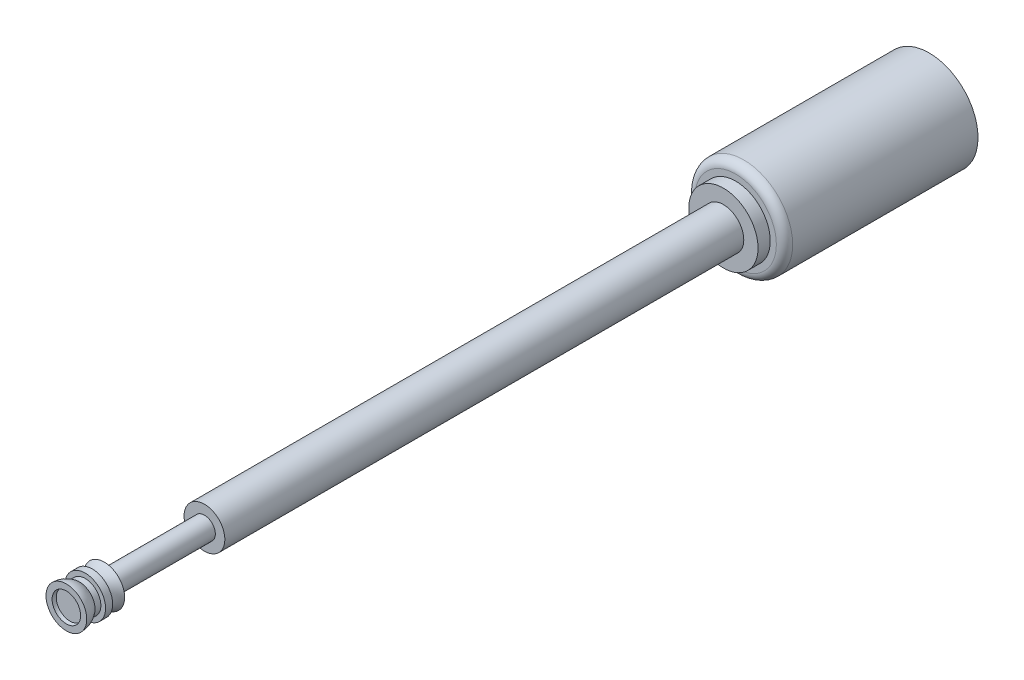
ISO-10303-21;
HEADER;
FILE_DESCRIPTION(('STEP AP214'),'2;1');
FILE_NAME('part.step','',(''),(''),'','','');
FILE_SCHEMA(('AUTOMOTIVE_DESIGN { 1 0 10303 214 1 1 1 1 }'));
ENDSEC;
DATA;
#1=APPLICATION_CONTEXT('core data for automotive mechanical design processes');
#2=APPLICATION_PROTOCOL_DEFINITION('international standard','automotive_design',2000,#1);
#3=PRODUCT_CONTEXT('',#1,'mechanical');
#4=PRODUCT('Part','Part','',(#3));
#5=PRODUCT_RELATED_PRODUCT_CATEGORY('part','',(#4));
#6=PRODUCT_DEFINITION_FORMATION('','',#4);
#7=PRODUCT_DEFINITION_CONTEXT('part definition',#1,'design');
#8=PRODUCT_DEFINITION('design','',#6,#7);
#9=PRODUCT_DEFINITION_SHAPE('','',#8);
#10=(LENGTH_UNIT() NAMED_UNIT(*) SI_UNIT(.MILLI.,.METRE.));
#11=(NAMED_UNIT(*) PLANE_ANGLE_UNIT() SI_UNIT($,.RADIAN.));
#12=(NAMED_UNIT(*) SI_UNIT($,.STERADIAN.) SOLID_ANGLE_UNIT());
#13=UNCERTAINTY_MEASURE_WITH_UNIT(LENGTH_MEASURE(1.E-05),#10,'distance_accuracy_value','');
#14=(GEOMETRIC_REPRESENTATION_CONTEXT(3) GLOBAL_UNCERTAINTY_ASSIGNED_CONTEXT((#13)) GLOBAL_UNIT_ASSIGNED_CONTEXT((#10,
#11,#12)) REPRESENTATION_CONTEXT('',''));
#15=CARTESIAN_POINT('',(0.,0.,0.));
#16=DIRECTION('',(0.,0.,1.));
#17=DIRECTION('',(1.,0.,0.));
#18=AXIS2_PLACEMENT_3D('',#15,#16,#17);
#19=CARTESIAN_POINT('',(0.,0.,15.5));
#20=DIRECTION('',(0.,0.,-1.));
#21=DIRECTION('',(-1.,0.,0.));
#22=AXIS2_PLACEMENT_3D('',#19,#20,#21);
#23=CYLINDRICAL_SURFACE('',#22,0.5);
#24=CARTESIAN_POINT('',(0.,0.,13.04));
#25=DIRECTION('',(0.,0.,-1.));
#26=DIRECTION('',(-1.,0.,0.));
#27=AXIS2_PLACEMENT_3D('',#24,#25,#26);
#28=CIRCLE('',#27,0.5);
#29=CARTESIAN_POINT('',(-0.5,0.,13.04));
#30=VERTEX_POINT('',#29);
#31=EDGE_CURVE('E56',#30,#30,#28,.T.);
#32=ORIENTED_EDGE('',*,*,#31,.T.);
#33=EDGE_LOOP('',(#32));
#34=FACE_BOUND('',#33,.T.);
#35=CARTESIAN_POINT('',(0.,0.,0.3));
#36=DIRECTION('',(0.,0.,1.));
#37=DIRECTION('',(1.,0.,0.));
#38=AXIS2_PLACEMENT_3D('',#35,#36,#37);
#39=CIRCLE('',#38,0.5);
#40=CARTESIAN_POINT('',(0.5,0.,0.3));
#41=VERTEX_POINT('',#40);
#42=EDGE_CURVE('E43',#41,#41,#39,.T.);
#43=ORIENTED_EDGE('',*,*,#42,.T.);
#44=EDGE_LOOP('',(#43));
#45=FACE_BOUND('',#44,.T.);
#46=ADVANCED_FACE('F32',(#34,#45),#23,.T.);
#47=CARTESIAN_POINT('',(0.,0.,0.3));
#48=DIRECTION('',(0.,0.,-1.));
#49=DIRECTION('',(-1.,0.,0.));
#50=AXIS2_PLACEMENT_3D('',#47,#48,#49);
#51=CYLINDRICAL_SURFACE('',#50,0.85);
#52=CARTESIAN_POINT('',(0.,0.,0.3));
#53=DIRECTION('',(0.,0.,1.));
#54=DIRECTION('',(1.,0.,0.));
#55=AXIS2_PLACEMENT_3D('',#52,#53,#54);
#56=CIRCLE('',#55,0.85);
#57=CARTESIAN_POINT('',(0.85,0.,0.3));
#58=VERTEX_POINT('',#57);
#59=EDGE_CURVE('E48',#58,#58,#56,.T.);
#60=ORIENTED_EDGE('',*,*,#59,.F.);
#61=EDGE_LOOP('',(#60));
#62=FACE_BOUND('',#61,.T.);
#63=CARTESIAN_POINT('',(0.,0.,0.));
#64=DIRECTION('',(0.,0.,1.));
#65=DIRECTION('',(1.,0.,0.));
#66=AXIS2_PLACEMENT_3D('',#63,#64,#65);
#67=CIRCLE('',#66,0.85);
#68=CARTESIAN_POINT('',(0.85,0.,0.));
#69=VERTEX_POINT('',#68);
#70=EDGE_CURVE('E102',#69,#69,#67,.T.);
#71=ORIENTED_EDGE('',*,*,#70,.T.);
#72=EDGE_LOOP('',(#71));
#73=FACE_BOUND('',#72,.T.);
#74=ADVANCED_FACE('F109',(#62,#73),#51,.T.);
#75=CARTESIAN_POINT('',(0.,0.,0.3));
#76=DIRECTION('',(0.,0.,1.));
#77=DIRECTION('',(1.,0.,0.));
#78=AXIS2_PLACEMENT_3D('',#75,#76,#77);
#79=PLANE('',#78);
#80=ORIENTED_EDGE('',*,*,#42,.F.);
#81=EDGE_LOOP('',(#80));
#82=FACE_BOUND('',#81,.T.);
#83=ORIENTED_EDGE('',*,*,#59,.T.);
#84=EDGE_LOOP('',(#83));
#85=FACE_BOUND('',#84,.T.);
#86=ADVANCED_FACE('F107',(#82,#85),#79,.T.);
#87=CARTESIAN_POINT('',(0.,0.,-4.75));
#88=DIRECTION('',(0.,0.,1.));
#89=DIRECTION('',(1.,0.,0.));
#90=AXIS2_PLACEMENT_3D('',#87,#88,#89);
#91=CYLINDRICAL_SURFACE('',#90,1.2);
#92=CARTESIAN_POINT('',(0.,0.,-0.2));
#93=DIRECTION('',(0.,0.,1.));
#94=DIRECTION('',(1.,0.,0.));
#95=AXIS2_PLACEMENT_3D('',#92,#93,#94);
#96=CIRCLE('',#95,1.2);
#97=CARTESIAN_POINT('',(1.2,0.,-0.2));
#98=VERTEX_POINT('',#97);
#99=EDGE_CURVE('E99',#98,#98,#96,.F.);
#100=ORIENTED_EDGE('',*,*,#99,.T.);
#101=EDGE_LOOP('',(#100));
#102=FACE_BOUND('',#101,.T.);
#103=CARTESIAN_POINT('',(0.,0.,-4.75));
#104=DIRECTION('',(0.,0.,1.));
#105=DIRECTION('',(1.,0.,0.));
#106=AXIS2_PLACEMENT_3D('',#103,#104,#105);
#107=CIRCLE('',#106,1.2);
#108=CARTESIAN_POINT('',(1.2,0.,-4.75));
#109=VERTEX_POINT('',#108);
#110=EDGE_CURVE('E93',#109,#109,#107,.T.);
#111=ORIENTED_EDGE('',*,*,#110,.T.);
#112=EDGE_LOOP('',(#111));
#113=FACE_BOUND('',#112,.T.);
#114=ADVANCED_FACE('F143',(#102,#113),#91,.T.);
#115=CARTESIAN_POINT('',(0.,0.,-4.75));
#116=DIRECTION('',(0.,0.,1.));
#117=DIRECTION('',(1.,0.,0.));
#118=AXIS2_PLACEMENT_3D('',#115,#116,#117);
#119=PLANE('',#118);
#120=ORIENTED_EDGE('',*,*,#110,.F.);
#121=EDGE_LOOP('',(#120));
#122=FACE_BOUND('',#121,.T.);
#123=ADVANCED_FACE('F119',(#122),#119,.F.);
#124=CARTESIAN_POINT('',(0.,0.,0.));
#125=DIRECTION('',(0.,0.,1.));
#126=DIRECTION('',(1.,0.,0.));
#127=AXIS2_PLACEMENT_3D('',#124,#125,#126);
#128=PLANE('',#127);
#129=ORIENTED_EDGE('',*,*,#70,.F.);
#130=EDGE_LOOP('',(#129));
#131=FACE_BOUND('',#130,.T.);
#132=CARTESIAN_POINT('',(0.,0.,0.));
#133=DIRECTION('',(0.,0.,1.));
#134=DIRECTION('',(1.,0.,0.));
#135=AXIS2_PLACEMENT_3D('',#132,#133,#134);
#136=CIRCLE('',#135,1.);
#137=CARTESIAN_POINT('',(1.,0.,0.));
#138=VERTEX_POINT('',#137);
#139=EDGE_CURVE('E96',#138,#138,#136,.T.);
#140=ORIENTED_EDGE('',*,*,#139,.T.);
#141=EDGE_LOOP('',(#140));
#142=FACE_BOUND('',#141,.T.);
#143=ADVANCED_FACE('F115',(#131,#142),#128,.T.);
#144=CARTESIAN_POINT('',(0.,0.,-0.2));
#145=DIRECTION('',(0.,0.,1.));
#146=DIRECTION('',(1.,0.,0.));
#147=AXIS2_PLACEMENT_3D('',#144,#145,#146);
#148=TOROIDAL_SURFACE('',#147,1.,0.2);
#149=ORIENTED_EDGE('',*,*,#99,.F.);
#150=EDGE_LOOP('',(#149));
#151=FACE_BOUND('',#150,.T.);
#152=ORIENTED_EDGE('',*,*,#139,.F.);
#153=EDGE_LOOP('',(#152));
#154=FACE_BOUND('',#153,.T.);
#155=ADVANCED_FACE('F118',(#151,#154),#148,.T.);
#156=CARTESIAN_POINT('',(-0.266992624909092,0.,13.04));
#157=DIRECTION('',(0.,0.,-1.));
#158=DIRECTION('',(-1.,0.,0.));
#159=AXIS2_PLACEMENT_3D('',#156,#157,#158);
#160=PLANE('',#159);
#161=CARTESIAN_POINT('',(0.,0.,13.04));
#162=DIRECTION('',(0.,0.,-1.));
#163=DIRECTION('',(-1.,0.,0.));
#164=AXIS2_PLACEMENT_3D('',#161,#162,#163);
#165=CIRCLE('',#164,0.266992624909092);
#166=CARTESIAN_POINT('',(-0.266992624909092,0.,13.04));
#167=VERTEX_POINT('',#166);
#168=EDGE_CURVE('E64',#167,#167,#165,.T.);
#169=ORIENTED_EDGE('',*,*,#168,.T.);
#170=EDGE_LOOP('',(#169));
#171=FACE_BOUND('',#170,.T.);
#172=ORIENTED_EDGE('',*,*,#31,.F.);
#173=EDGE_LOOP('',(#172));
#174=FACE_BOUND('',#173,.T.);
#175=ADVANCED_FACE('F124',(#171,#174),#160,.F.);
#176=CARTESIAN_POINT('',(-0.266992624909092,0.,15.5));
#177=DIRECTION('',(0.,0.,1.));
#178=DIRECTION('',(1.,0.,0.));
#179=AXIS2_PLACEMENT_3D('',#176,#177,#178);
#180=PLANE('',#179);
#181=CARTESIAN_POINT('',(0.,0.,15.5));
#182=DIRECTION('',(0.,0.,-1.));
#183=DIRECTION('',(-1.,0.,0.));
#184=AXIS2_PLACEMENT_3D('',#181,#182,#183);
#185=CIRCLE('',#184,0.266992624909092);
#186=CARTESIAN_POINT('',(-0.266992624909092,0.,15.5));
#187=VERTEX_POINT('',#186);
#188=EDGE_CURVE('E69',#187,#187,#185,.T.);
#189=ORIENTED_EDGE('',*,*,#188,.F.);
#190=EDGE_LOOP('',(#189));
#191=FACE_BOUND('',#190,.T.);
#192=CARTESIAN_POINT('',(0.,0.,15.5));
#193=DIRECTION('',(0.,0.,-1.));
#194=DIRECTION('',(-1.,0.,0.));
#195=AXIS2_PLACEMENT_3D('',#192,#193,#194);
#196=CIRCLE('',#195,0.499999999999999);
#197=CARTESIAN_POINT('',(-0.499999999999999,0.,15.5));
#198=VERTEX_POINT('',#197);
#199=EDGE_CURVE('E60',#198,#198,#196,.F.);
#200=ORIENTED_EDGE('',*,*,#199,.F.);
#201=EDGE_LOOP('',(#200));
#202=FACE_BOUND('',#201,.T.);
#203=ADVANCED_FACE('F130',(#191,#202),#180,.F.);
#204=CARTESIAN_POINT('',(0.,0.,15.5));
#205=DIRECTION('',(0.,0.,-1.));
#206=DIRECTION('',(-1.,0.,0.));
#207=AXIS2_PLACEMENT_3D('',#204,#205,#206);
#208=CYLINDRICAL_SURFACE('',#207,0.266992624909092);
#209=ORIENTED_EDGE('',*,*,#168,.F.);
#210=EDGE_LOOP('',(#209));
#211=FACE_BOUND('',#210,.T.);
#212=ORIENTED_EDGE('',*,*,#188,.T.);
#213=EDGE_LOOP('',(#212));
#214=FACE_BOUND('',#213,.T.);
#215=ADVANCED_FACE('F186',(#211,#214),#208,.T.);
#216=CARTESIAN_POINT('',(0.,0.,16.34));
#217=DIRECTION('',(0.,0.,1.));
#218=DIRECTION('',(1.,0.,0.));
#219=AXIS2_PLACEMENT_3D('',#216,#217,#218);
#220=PLANE('',#219);
#221=CARTESIAN_POINT('',(0.,0.,16.34));
#222=DIRECTION('',(0.,0.,1.));
#223=DIRECTION('',(1.,0.,0.));
#224=AXIS2_PLACEMENT_3D('',#221,#222,#223);
#225=CIRCLE('',#224,0.338230690505755);
#226=CARTESIAN_POINT('',(0.338230690505755,0.,16.34));
#227=VERTEX_POINT('',#226);
#228=EDGE_CURVE('E52',#227,#227,#225,.F.);
#229=ORIENTED_EDGE('',*,*,#228,.F.);
#230=EDGE_LOOP('',(#229));
#231=FACE_BOUND('',#230,.T.);
#232=ADVANCED_FACE('F178',(#231),#220,.T.);
#233=CARTESIAN_POINT('',(0.,0.,16.43));
#234=DIRECTION('',(0.,0.,-1.));
#235=DIRECTION('',(1.,0.,0.));
#236=AXIS2_PLACEMENT_3D('',#233,#234,#235);
#237=SPHERICAL_SURFACE('',#236,0.35);
#238=ORIENTED_EDGE('',*,*,#228,.T.);
#239=EDGE_LOOP('',(#238));
#240=FACE_BOUND('',#239,.T.);
#241=CARTESIAN_POINT('',(0.,0.,16.43));
#242=DIRECTION('',(0.,0.,-1.));
#243=DIRECTION('',(-1.,0.,0.));
#244=AXIS2_PLACEMENT_3D('',#241,#242,#243);
#245=CIRCLE('',#244,0.35);
#246=CARTESIAN_POINT('',(-0.35,0.,16.43));
#247=VERTEX_POINT('',#246);
#248=EDGE_CURVE('E58',#247,#247,#245,.T.);
#249=ORIENTED_EDGE('',*,*,#248,.F.);
#250=EDGE_LOOP('',(#249));
#251=FACE_BOUND('',#250,.T.);
#252=ADVANCED_FACE('F168',(#240,#251),#237,.F.);
#253=CARTESIAN_POINT('',(0.35,0.,16.43));
#254=DIRECTION('',(0.,0.,-1.));
#255=DIRECTION('',(-1.,0.,0.));
#256=AXIS2_PLACEMENT_3D('',#253,#254,#255);
#257=PLANE('',#256);
#258=CARTESIAN_POINT('',(0.,0.,16.43));
#259=DIRECTION('',(0.,0.,-1.));
#260=DIRECTION('',(-1.,0.,0.));
#261=AXIS2_PLACEMENT_3D('',#258,#259,#260);
#262=CIRCLE('',#261,0.5);
#263=CARTESIAN_POINT('',(-0.5,0.,16.43));
#264=VERTEX_POINT('',#263);
#265=EDGE_CURVE('E75',#264,#264,#262,.T.);
#266=ORIENTED_EDGE('',*,*,#265,.F.);
#267=EDGE_LOOP('',(#266));
#268=FACE_BOUND('',#267,.T.);
#269=ORIENTED_EDGE('',*,*,#248,.T.);
#270=EDGE_LOOP('',(#269));
#271=FACE_BOUND('',#270,.T.);
#272=ADVANCED_FACE('F177',(#268,#271),#257,.F.);
#273=CARTESIAN_POINT('',(0.,0.,16.43));
#274=DIRECTION('',(0.,0.,-1.));
#275=DIRECTION('',(1.,0.,0.));
#276=AXIS2_PLACEMENT_3D('',#273,#274,#275);
#277=SPHERICAL_SURFACE('',#276,0.499999999999999);
#278=CARTESIAN_POINT('',(0.,0.,16.1113820747194));
#279=DIRECTION('',(0.,0.,-1.));
#280=DIRECTION('',(-1.,0.,0.));
#281=AXIS2_PLACEMENT_3D('',#278,#279,#280);
#282=CIRCLE('',#281,0.385334423183124);
#283=CARTESIAN_POINT('',(-0.385334423183124,0.,16.1113820747194));
#284=VERTEX_POINT('',#283);
#285=EDGE_CURVE('E78',#284,#284,#282,.T.);
#286=ORIENTED_EDGE('',*,*,#285,.F.);
#287=EDGE_LOOP('',(#286));
#288=FACE_BOUND('',#287,.T.);
#289=ORIENTED_EDGE('',*,*,#265,.T.);
#290=EDGE_LOOP('',(#289));
#291=FACE_BOUND('',#290,.T.);
#292=ADVANCED_FACE('F184',(#288,#291),#277,.T.);
#293=CARTESIAN_POINT('',(0.,0.,15.5));
#294=DIRECTION('',(0.,0.,-1.));
#295=DIRECTION('',(-1.,0.,0.));
#296=AXIS2_PLACEMENT_3D('',#293,#294,#295);
#297=CYLINDRICAL_SURFACE('',#296,0.385334423183123);
#298=CARTESIAN_POINT('',(0.,0.,15.9679785667846));
#299=DIRECTION('',(0.,0.,-1.));
#300=DIRECTION('',(-1.,0.,0.));
#301=AXIS2_PLACEMENT_3D('',#298,#299,#300);
#302=CIRCLE('',#301,0.385334423183123);
#303=CARTESIAN_POINT('',(-0.385334423183123,0.,15.9679785667846));
#304=VERTEX_POINT('',#303);
#305=EDGE_CURVE('E81',#304,#304,#302,.T.);
#306=ORIENTED_EDGE('',*,*,#305,.F.);
#307=EDGE_LOOP('',(#306));
#308=FACE_BOUND('',#307,.T.);
#309=ORIENTED_EDGE('',*,*,#285,.T.);
#310=EDGE_LOOP('',(#309));
#311=FACE_BOUND('',#310,.T.);
#312=ADVANCED_FACE('F325',(#308,#311),#297,.T.);
#313=CARTESIAN_POINT('',(0.385334423183123,0.,15.9679785667846));
#314=DIRECTION('',(0.,0.,-1.));
#315=DIRECTION('',(-1.,0.,0.));
#316=AXIS2_PLACEMENT_3D('',#313,#314,#315);
#317=PLANE('',#316);
#318=CARTESIAN_POINT('',(0.,0.,15.9679785667846));
#319=DIRECTION('',(0.,0.,-1.));
#320=DIRECTION('',(-1.,0.,0.));
#321=AXIS2_PLACEMENT_3D('',#318,#319,#320);
#322=CIRCLE('',#321,0.5);
#323=CARTESIAN_POINT('',(-0.5,0.,15.9679785667846));
#324=VERTEX_POINT('',#323);
#325=EDGE_CURVE('E84',#324,#324,#322,.T.);
#326=ORIENTED_EDGE('',*,*,#325,.F.);
#327=EDGE_LOOP('',(#326));
#328=FACE_BOUND('',#327,.T.);
#329=ORIENTED_EDGE('',*,*,#305,.T.);
#330=EDGE_LOOP('',(#329));
#331=FACE_BOUND('',#330,.T.);
#332=ADVANCED_FACE('F315',(#328,#331),#317,.F.);
#333=CARTESIAN_POINT('',(0.,0.,15.5));
#334=DIRECTION('',(0.,0.,-1.));
#335=DIRECTION('',(-1.,0.,0.));
#336=AXIS2_PLACEMENT_3D('',#333,#334,#335);
#337=CYLINDRICAL_SURFACE('',#336,0.5);
#338=CARTESIAN_POINT('',(0.,0.,15.7933109872127));
#339=DIRECTION('',(0.,0.,-1.));
#340=DIRECTION('',(-1.,0.,0.));
#341=AXIS2_PLACEMENT_3D('',#338,#339,#340);
#342=CIRCLE('',#341,0.5);
#343=CARTESIAN_POINT('',(-0.5,0.,15.7933109872127));
#344=VERTEX_POINT('',#343);
#345=EDGE_CURVE('E87',#344,#344,#342,.T.);
#346=ORIENTED_EDGE('',*,*,#345,.F.);
#347=EDGE_LOOP('',(#346));
#348=FACE_BOUND('',#347,.T.);
#349=ORIENTED_EDGE('',*,*,#325,.T.);
#350=EDGE_LOOP('',(#349));
#351=FACE_BOUND('',#350,.T.);
#352=ADVANCED_FACE('F305',(#348,#351),#337,.T.);
#353=CARTESIAN_POINT('',(0.5,0.,15.7933109872127));
#354=DIRECTION('',(0.,0.,1.));
#355=DIRECTION('',(1.,0.,0.));
#356=AXIS2_PLACEMENT_3D('',#353,#354,#355);
#357=PLANE('',#356);
#358=CARTESIAN_POINT('',(0.,0.,15.7933109872127));
#359=DIRECTION('',(0.,0.,-1.));
#360=DIRECTION('',(-1.,0.,0.));
#361=AXIS2_PLACEMENT_3D('',#358,#359,#360);
#362=CIRCLE('',#361,0.416056350546994);
#363=CARTESIAN_POINT('',(-0.416056350546994,0.,15.7933109872127));
#364=VERTEX_POINT('',#363);
#365=EDGE_CURVE('E90',#364,#364,#362,.T.);
#366=ORIENTED_EDGE('',*,*,#365,.F.);
#367=EDGE_LOOP('',(#366));
#368=FACE_BOUND('',#367,.T.);
#369=ORIENTED_EDGE('',*,*,#345,.T.);
#370=EDGE_LOOP('',(#369));
#371=FACE_BOUND('',#370,.T.);
#372=ADVANCED_FACE('F296',(#368,#371),#357,.F.);
#373=CARTESIAN_POINT('',(0.,0.,15.7933109872127));
#374=DIRECTION('',(0.,0.,-1.));
#375=DIRECTION('',(-1.,0.,0.));
#376=AXIS2_PLACEMENT_3D('',#373,#374,#375);
#377=TOROIDAL_SURFACE('',#376,0.970463218187957,0.554406867640962);
#378=ORIENTED_EDGE('',*,*,#199,.T.);
#379=EDGE_LOOP('',(#378));
#380=FACE_BOUND('',#379,.T.);
#381=ORIENTED_EDGE('',*,*,#365,.T.);
#382=EDGE_LOOP('',(#381));
#383=FACE_BOUND('',#382,.T.);
#384=ADVANCED_FACE('F293',(#380,#383),#377,.F.);
#385=CLOSED_SHELL('',(#46,#74,#86,#114,#123,#143,#155,#175,#203,#215,#232,#252,#272,#292,#312,
#332,#352,#372,#384));
#386=CARTESIAN_POINT('',(0.,0.,16.3037364268854));
#387=DIRECTION('',(0.,0.,-1.));
#388=DIRECTION('',(-1.,0.,0.));
#389=AXIS2_PLACEMENT_3D('',#386,#387,#388);
#390=CIRCLE('',#389,0.326431478421327);
#391=CARTESIAN_POINT('',(-0.326431478421327,0.,16.3037364268854));
#392=VERTEX_POINT('',#391);
#393=EDGE_CURVE('E55',#392,#392,#390,.F.);
#394=ORIENTED_EDGE('',*,*,#393,.T.);
#395=EDGE_LOOP('',(#394));
#396=FACE_BOUND('',#395,.T.);
#397=ADVANCED_FACE('F163',(#396),#237,.F.);
#398=CARTESIAN_POINT('',(0.,0.,16.3037364268854));
#399=DIRECTION('',(0.,0.,-1.));
#400=DIRECTION('',(-1.,0.,0.));
#401=AXIS2_PLACEMENT_3D('',#398,#399,#400);
#402=PLANE('',#401);
#403=ORIENTED_EDGE('',*,*,#393,.F.);
#404=EDGE_LOOP('',(#403));
#405=FACE_BOUND('',#404,.T.);
#406=ADVANCED_FACE('F165',(#405),#402,.T.);
#407=CLOSED_SHELL('',(#397,#406));
#408=CARTESIAN_POINT('',(0.,0.,-4.45));
#409=DIRECTION('',(0.,0.,-1.));
#410=DIRECTION('',(-1.,0.,0.));
#411=AXIS2_PLACEMENT_3D('',#408,#409,#410);
#412=PLANE('',#411);
#413=CARTESIAN_POINT('',(0.,0.,-4.45));
#414=DIRECTION('',(0.,0.,-1.));
#415=DIRECTION('',(-1.,0.,0.));
#416=AXIS2_PLACEMENT_3D('',#413,#414,#415);
#417=CIRCLE('',#416,0.5);
#418=CARTESIAN_POINT('',(-0.5,0.,-4.45));
#419=VERTEX_POINT('',#418);
#420=EDGE_CURVE('E10',#419,#419,#417,.F.);
#421=ORIENTED_EDGE('',*,*,#420,.T.);
#422=EDGE_LOOP('',(#421));
#423=FACE_BOUND('',#422,.T.);
#424=ADVANCED_FACE('F151',(#423),#412,.F.);
#425=CARTESIAN_POINT('',(0.,0.,0.));
#426=DIRECTION('',(0.,0.,1.));
#427=DIRECTION('',(1.,0.,0.));
#428=AXIS2_PLACEMENT_3D('',#425,#426,#427);
#429=PLANE('',#428);
#430=CARTESIAN_POINT('',(0.,0.,0.));
#431=DIRECTION('',(0.,0.,1.));
#432=DIRECTION('',(1.,0.,0.));
#433=AXIS2_PLACEMENT_3D('',#430,#431,#432);
#434=CIRCLE('',#433,0.5);
#435=CARTESIAN_POINT('',(0.5,0.,0.));
#436=VERTEX_POINT('',#435);
#437=EDGE_CURVE('E39',#436,#436,#434,.T.);
#438=ORIENTED_EDGE('',*,*,#437,.F.);
#439=EDGE_LOOP('',(#438));
#440=FACE_BOUND('',#439,.T.);
#441=ADVANCED_FACE('F148',(#440),#429,.F.);
#442=CARTESIAN_POINT('',(0.,0.,-4.75));
#443=DIRECTION('',(0.,0.,1.));
#444=DIRECTION('',(1.,0.,0.));
#445=AXIS2_PLACEMENT_3D('',#442,#443,#444);
#446=CYLINDRICAL_SURFACE('',#445,0.5);
#447=ORIENTED_EDGE('',*,*,#437,.T.);
#448=EDGE_LOOP('',(#447));
#449=FACE_BOUND('',#448,.T.);
#450=ORIENTED_EDGE('',*,*,#420,.F.);
#451=EDGE_LOOP('',(#450));
#452=FACE_BOUND('',#451,.T.);
#453=ADVANCED_FACE('F150',(#449,#452),#446,.F.);
#454=CLOSED_SHELL('',(#424,#441,#453));
#455=ORIENTED_CLOSED_SHELL('',*,#407,.T.);
#456=ORIENTED_CLOSED_SHELL('',*,#454,.T.);
#457=BREP_WITH_VOIDS('B2',#385,(#455,#456));
#458=ADVANCED_BREP_SHAPE_REPRESENTATION('',(#18,#457),#14);
#459=SHAPE_DEFINITION_REPRESENTATION(#9,#458);
ENDSEC;
END-ISO-10303-21;
